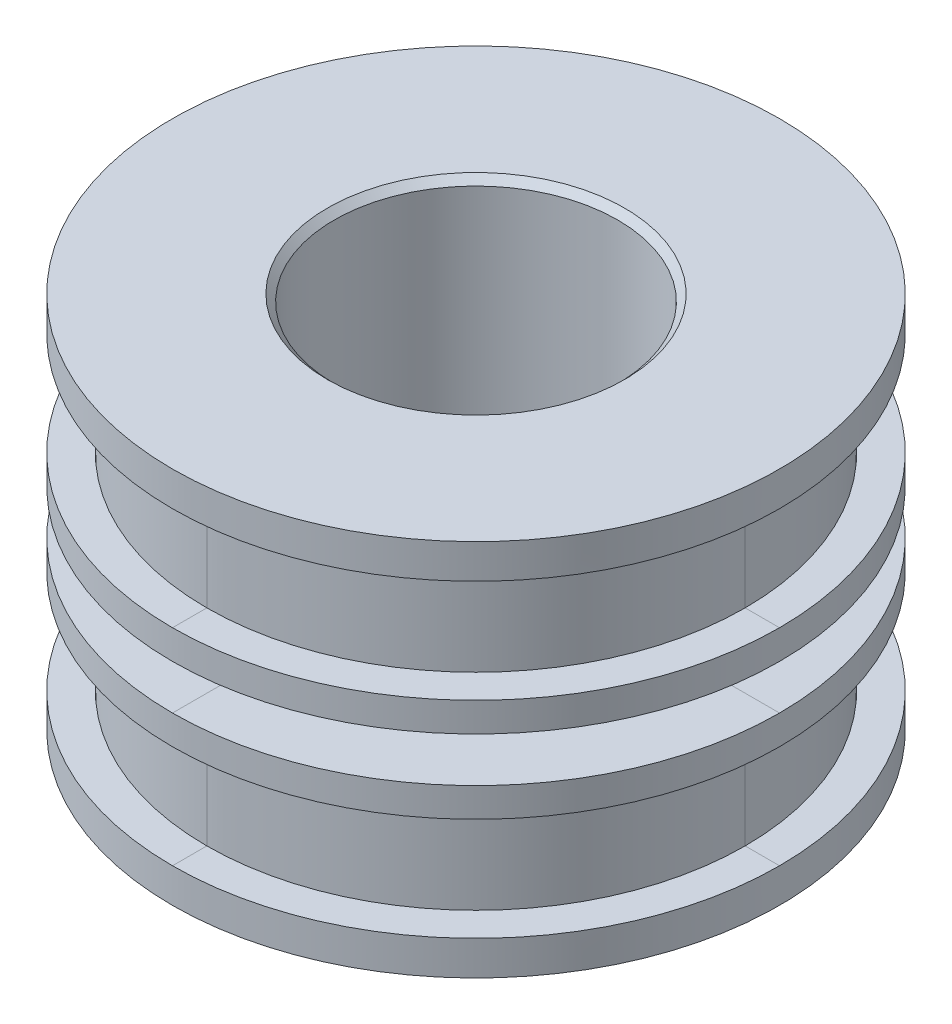
ISO-10303-21;
HEADER;
FILE_DESCRIPTION(('STEP AP214'),'2;1');
FILE_NAME('part.step','',(''),(''),'','','');
FILE_SCHEMA(('AUTOMOTIVE_DESIGN { 1 0 10303 214 1 1 1 1 }'));
ENDSEC;
DATA;
#1=APPLICATION_CONTEXT('core data for automotive mechanical design processes');
#2=APPLICATION_PROTOCOL_DEFINITION('international standard','automotive_design',2000,#1);
#3=PRODUCT_CONTEXT('',#1,'mechanical');
#4=PRODUCT('Part','Part','',(#3));
#5=PRODUCT_RELATED_PRODUCT_CATEGORY('part','',(#4));
#6=PRODUCT_DEFINITION_FORMATION('','',#4);
#7=PRODUCT_DEFINITION_CONTEXT('part definition',#1,'design');
#8=PRODUCT_DEFINITION('design','',#6,#7);
#9=PRODUCT_DEFINITION_SHAPE('','',#8);
#10=(LENGTH_UNIT() NAMED_UNIT(*) SI_UNIT(.MILLI.,.METRE.));
#11=(NAMED_UNIT(*) PLANE_ANGLE_UNIT() SI_UNIT($,.RADIAN.));
#12=(NAMED_UNIT(*) SI_UNIT($,.STERADIAN.) SOLID_ANGLE_UNIT());
#13=UNCERTAINTY_MEASURE_WITH_UNIT(LENGTH_MEASURE(1.E-05),#10,'distance_accuracy_value','');
#14=(GEOMETRIC_REPRESENTATION_CONTEXT(3) GLOBAL_UNCERTAINTY_ASSIGNED_CONTEXT((#13)) GLOBAL_UNIT_ASSIGNED_CONTEXT((#10,
#11,#12)) REPRESENTATION_CONTEXT('',''));
#15=CARTESIAN_POINT('',(0.,0.,0.));
#16=DIRECTION('',(0.,0.,1.));
#17=DIRECTION('',(1.,0.,0.));
#18=AXIS2_PLACEMENT_3D('',#15,#16,#17);
#19=CARTESIAN_POINT('',(0.,-27.5,0.));
#20=DIRECTION('',(0.,1.,0.));
#21=DIRECTION('',(0.,0.,1.));
#22=AXIS2_PLACEMENT_3D('',#19,#20,#21);
#23=CYLINDRICAL_SURFACE('',#22,20.625);
#24=CARTESIAN_POINT('',(0.,26.5,0.));
#25=DIRECTION('',(0.,1.,0.));
#26=DIRECTION('',(0.,0.,1.));
#27=AXIS2_PLACEMENT_3D('',#24,#25,#26);
#28=CIRCLE('',#27,20.625);
#29=CARTESIAN_POINT('',(0.,26.5,20.625));
#30=VERTEX_POINT('',#29);
#31=EDGE_CURVE('E314',#30,#30,#28,.T.);
#32=ORIENTED_EDGE('',*,*,#31,.T.);
#33=EDGE_LOOP('',(#32));
#34=FACE_BOUND('',#33,.T.);
#35=CARTESIAN_POINT('',(0.,-12.5,0.));
#36=DIRECTION('',(0.,-1.,0.));
#37=DIRECTION('',(0.,0.,-1.));
#38=AXIS2_PLACEMENT_3D('',#35,#36,#37);
#39=CIRCLE('',#38,20.625);
#40=CARTESIAN_POINT('',(0.,-12.5,-20.625));
#41=VERTEX_POINT('',#40);
#42=EDGE_CURVE('E169',#41,#41,#39,.F.);
#43=ORIENTED_EDGE('',*,*,#42,.F.);
#44=EDGE_LOOP('',(#43));
#45=FACE_BOUND('',#44,.T.);
#46=ADVANCED_FACE('F45',(#34,#45),#23,.F.);
#47=CARTESIAN_POINT('',(0.,27.5,0.));
#48=DIRECTION('',(0.,-1.,0.));
#49=DIRECTION('',(0.,0.,-1.));
#50=AXIS2_PLACEMENT_3D('',#47,#48,#49);
#51=CYLINDRICAL_SURFACE('',#50,44.175);
#52=CARTESIAN_POINT('',(0.,-3.25,0.));
#53=DIRECTION('',(0.,-1.,0.));
#54=DIRECTION('',(1.,0.,0.));
#55=AXIS2_PLACEMENT_3D('',#52,#53,#54);
#56=CIRCLE('',#55,44.175);
#57=CARTESIAN_POINT('',(44.175,-3.25,0.));
#58=VERTEX_POINT('',#57);
#59=CARTESIAN_POINT('',(0.,-3.25,44.175));
#60=VERTEX_POINT('',#59);
#61=EDGE_CURVE('E262',#58,#60,#56,.T.);
#62=ORIENTED_EDGE('',*,*,#61,.T.);
#63=CARTESIAN_POINT('',(0.,-3.25,0.));
#64=DIRECTION('',(0.,-1.,0.));
#65=DIRECTION('',(0.,0.,1.));
#66=AXIS2_PLACEMENT_3D('',#63,#64,#65);
#67=CIRCLE('',#66,44.175);
#68=EDGE_CURVE('E272',#60,#58,#67,.T.);
#69=ORIENTED_EDGE('',*,*,#68,.T.);
#70=EDGE_LOOP('',(#62,#69));
#71=FACE_BOUND('',#70,.T.);
#72=CARTESIAN_POINT('',(0.,-7.5,0.));
#73=DIRECTION('',(0.,-1.,0.));
#74=DIRECTION('',(1.,0.,0.));
#75=AXIS2_PLACEMENT_3D('',#72,#73,#74);
#76=CIRCLE('',#75,44.175);
#77=CARTESIAN_POINT('',(44.175,-7.5,0.));
#78=VERTEX_POINT('',#77);
#79=CARTESIAN_POINT('',(0.,-7.5,44.175));
#80=VERTEX_POINT('',#79);
#81=EDGE_CURVE('E193',#78,#80,#76,.T.);
#82=ORIENTED_EDGE('',*,*,#81,.F.);
#83=CARTESIAN_POINT('',(0.,-7.5,0.));
#84=DIRECTION('',(0.,-1.,0.));
#85=DIRECTION('',(0.,0.,1.));
#86=AXIS2_PLACEMENT_3D('',#83,#84,#85);
#87=CIRCLE('',#86,44.175);
#88=EDGE_CURVE('E159',#80,#78,#87,.T.);
#89=ORIENTED_EDGE('',*,*,#88,.F.);
#90=EDGE_LOOP('',(#82,#89));
#91=FACE_BOUND('',#90,.T.);
#92=ADVANCED_FACE('F340',(#71,#91),#51,.T.);
#93=CARTESIAN_POINT('',(0.,3.25,0.));
#94=DIRECTION('',(0.,-1.,0.));
#95=DIRECTION('',(1.,0.,0.));
#96=AXIS2_PLACEMENT_3D('',#93,#94,#95);
#97=CIRCLE('',#96,44.175);
#98=CARTESIAN_POINT('',(44.175,3.25,0.));
#99=VERTEX_POINT('',#98);
#100=CARTESIAN_POINT('',(0.,3.25,44.175));
#101=VERTEX_POINT('',#100);
#102=EDGE_CURVE('E257',#99,#101,#97,.T.);
#103=ORIENTED_EDGE('',*,*,#102,.F.);
#104=CARTESIAN_POINT('',(0.,3.25,0.));
#105=DIRECTION('',(0.,-1.,0.));
#106=DIRECTION('',(0.,0.,1.));
#107=AXIS2_PLACEMENT_3D('',#104,#105,#106);
#108=CIRCLE('',#107,44.175);
#109=EDGE_CURVE('E267',#101,#99,#108,.T.);
#110=ORIENTED_EDGE('',*,*,#109,.F.);
#111=EDGE_LOOP('',(#103,#110));
#112=FACE_BOUND('',#111,.T.);
#113=CARTESIAN_POINT('',(0.,7.5,0.));
#114=DIRECTION('',(0.,-1.,0.));
#115=DIRECTION('',(1.,0.,0.));
#116=AXIS2_PLACEMENT_3D('',#113,#114,#115);
#117=CIRCLE('',#116,44.175);
#118=CARTESIAN_POINT('',(44.175,7.5,0.));
#119=VERTEX_POINT('',#118);
#120=CARTESIAN_POINT('',(0.,7.5,44.175));
#121=VERTEX_POINT('',#120);
#122=EDGE_CURVE('E209',#119,#121,#117,.T.);
#123=ORIENTED_EDGE('',*,*,#122,.T.);
#124=CARTESIAN_POINT('',(0.,7.5,0.));
#125=DIRECTION('',(0.,-1.,0.));
#126=DIRECTION('',(0.,0.,1.));
#127=AXIS2_PLACEMENT_3D('',#124,#125,#126);
#128=CIRCLE('',#127,44.175);
#129=EDGE_CURVE('E219',#121,#119,#128,.T.);
#130=ORIENTED_EDGE('',*,*,#129,.T.);
#131=EDGE_LOOP('',(#123,#130));
#132=FACE_BOUND('',#131,.T.);
#133=ADVANCED_FACE('F346',(#112,#132),#51,.T.);
#134=CARTESIAN_POINT('',(0.,-3.25,33.175));
#135=DIRECTION('',(0.,-1.,0.));
#136=DIRECTION('',(0.,0.,-1.));
#137=AXIS2_PLACEMENT_3D('',#134,#135,#136);
#138=PLANE('',#137);
#139=DIRECTION('',(1.,0.,0.));
#140=VECTOR('',#139,1.);
#141=CARTESIAN_POINT('',(33.175,-3.25,0.));
#142=LINE('',#141,#140);
#143=CARTESIAN_POINT('',(33.175,-3.25,0.));
#144=VERTEX_POINT('',#143);
#145=EDGE_CURVE('E266',#144,#58,#142,.T.);
#146=ORIENTED_EDGE('',*,*,#145,.T.);
#147=ORIENTED_EDGE('',*,*,#68,.F.);
#148=DIRECTION('',(0.,0.,1.));
#149=VECTOR('',#148,1.);
#150=CARTESIAN_POINT('',(0.,-3.25,33.175));
#151=LINE('',#150,#149);
#152=CARTESIAN_POINT('',(0.,-3.25,33.175));
#153=VERTEX_POINT('',#152);
#154=EDGE_CURVE('E276',#153,#60,#151,.T.);
#155=ORIENTED_EDGE('',*,*,#154,.F.);
#156=CARTESIAN_POINT('',(0.,-3.25,0.));
#157=DIRECTION('',(0.,-1.,0.));
#158=DIRECTION('',(0.,0.,1.));
#159=AXIS2_PLACEMENT_3D('',#156,#157,#158);
#160=CIRCLE('',#159,33.175);
#161=EDGE_CURVE('E291',#153,#144,#160,.T.);
#162=ORIENTED_EDGE('',*,*,#161,.T.);
#163=EDGE_LOOP('',(#146,#147,#155,#162));
#164=FACE_BOUND('',#163,.T.);
#165=ADVANCED_FACE('F410',(#164),#138,.F.);
#166=CARTESIAN_POINT('',(0.,27.5,0.));
#167=DIRECTION('',(0.,-1.,0.));
#168=DIRECTION('',(0.,0.,-1.));
#169=AXIS2_PLACEMENT_3D('',#166,#167,#168);
#170=CYLINDRICAL_SURFACE('',#169,33.175);
#171=DIRECTION('',(0.,-1.,0.));
#172=VECTOR('',#171,1.);
#173=CARTESIAN_POINT('',(33.175,-3.25,0.));
#174=LINE('',#173,#172);
#175=CARTESIAN_POINT('',(33.175,3.25,0.));
#176=VERTEX_POINT('',#175);
#177=EDGE_CURVE('E280',#176,#144,#174,.T.);
#178=ORIENTED_EDGE('',*,*,#177,.T.);
#179=ORIENTED_EDGE('',*,*,#161,.F.);
#180=DIRECTION('',(0.,-1.,0.));
#181=VECTOR('',#180,1.);
#182=CARTESIAN_POINT('',(0.,-3.25,33.175));
#183=LINE('',#182,#181);
#184=CARTESIAN_POINT('',(0.,3.25,33.175));
#185=VERTEX_POINT('',#184);
#186=EDGE_CURVE('E288',#185,#153,#183,.T.);
#187=ORIENTED_EDGE('',*,*,#186,.F.);
#188=CARTESIAN_POINT('',(0.,3.25,0.));
#189=DIRECTION('',(0.,-1.,0.));
#190=DIRECTION('',(0.,0.,1.));
#191=AXIS2_PLACEMENT_3D('',#188,#189,#190);
#192=CIRCLE('',#191,33.175);
#193=EDGE_CURVE('E271',#185,#176,#192,.T.);
#194=ORIENTED_EDGE('',*,*,#193,.T.);
#195=EDGE_LOOP('',(#178,#179,#187,#194));
#196=FACE_BOUND('',#195,.T.);
#197=ADVANCED_FACE('F403',(#196),#170,.T.);
#198=CARTESIAN_POINT('',(0.,3.25,33.175));
#199=DIRECTION('',(0.,1.,0.));
#200=DIRECTION('',(0.,0.,1.));
#201=AXIS2_PLACEMENT_3D('',#198,#199,#200);
#202=PLANE('',#201);
#203=DIRECTION('',(-1.,0.,0.));
#204=VECTOR('',#203,1.);
#205=CARTESIAN_POINT('',(33.175,3.25,0.));
#206=LINE('',#205,#204);
#207=EDGE_CURVE('E251',#99,#176,#206,.T.);
#208=ORIENTED_EDGE('',*,*,#207,.T.);
#209=ORIENTED_EDGE('',*,*,#193,.F.);
#210=DIRECTION('',(0.,0.,-1.));
#211=VECTOR('',#210,1.);
#212=CARTESIAN_POINT('',(0.,3.25,33.175));
#213=LINE('',#212,#211);
#214=EDGE_CURVE('E261',#101,#185,#213,.T.);
#215=ORIENTED_EDGE('',*,*,#214,.F.);
#216=ORIENTED_EDGE('',*,*,#109,.T.);
#217=EDGE_LOOP('',(#208,#209,#215,#216));
#218=FACE_BOUND('',#217,.T.);
#219=ADVANCED_FACE('F399',(#218),#202,.F.);
#220=CARTESIAN_POINT('',(33.175,-3.25,0.));
#221=DIRECTION('',(0.,-1.,0.));
#222=DIRECTION('',(0.,0.,-1.));
#223=AXIS2_PLACEMENT_3D('',#220,#221,#222);
#224=PLANE('',#223);
#225=ORIENTED_EDGE('',*,*,#154,.T.);
#226=ORIENTED_EDGE('',*,*,#61,.F.);
#227=ORIENTED_EDGE('',*,*,#145,.F.);
#228=CARTESIAN_POINT('',(0.,-3.25,0.));
#229=DIRECTION('',(0.,-1.,0.));
#230=DIRECTION('',(1.,0.,0.));
#231=AXIS2_PLACEMENT_3D('',#228,#229,#230);
#232=CIRCLE('',#231,33.175);
#233=EDGE_CURVE('E298',#144,#153,#232,.T.);
#234=ORIENTED_EDGE('',*,*,#233,.T.);
#235=EDGE_LOOP('',(#225,#226,#227,#234));
#236=FACE_BOUND('',#235,.T.);
#237=ADVANCED_FACE('F402',(#236),#224,.F.);
#238=CARTESIAN_POINT('',(0.,27.5,0.));
#239=DIRECTION('',(0.,-1.,0.));
#240=DIRECTION('',(0.,0.,-1.));
#241=AXIS2_PLACEMENT_3D('',#238,#239,#240);
#242=CYLINDRICAL_SURFACE('',#241,33.175);
#243=ORIENTED_EDGE('',*,*,#233,.F.);
#244=ORIENTED_EDGE('',*,*,#177,.F.);
#245=CARTESIAN_POINT('',(0.,3.25,0.));
#246=DIRECTION('',(0.,-1.,0.));
#247=DIRECTION('',(1.,0.,0.));
#248=AXIS2_PLACEMENT_3D('',#245,#246,#247);
#249=CIRCLE('',#248,33.175);
#250=EDGE_CURVE('E284',#176,#185,#249,.T.);
#251=ORIENTED_EDGE('',*,*,#250,.T.);
#252=ORIENTED_EDGE('',*,*,#186,.T.);
#253=EDGE_LOOP('',(#243,#244,#251,#252));
#254=FACE_BOUND('',#253,.T.);
#255=ADVANCED_FACE('F397',(#254),#242,.T.);
#256=CARTESIAN_POINT('',(33.175,3.25,0.));
#257=DIRECTION('',(0.,1.,0.));
#258=DIRECTION('',(0.,0.,1.));
#259=AXIS2_PLACEMENT_3D('',#256,#257,#258);
#260=PLANE('',#259);
#261=ORIENTED_EDGE('',*,*,#250,.F.);
#262=ORIENTED_EDGE('',*,*,#207,.F.);
#263=ORIENTED_EDGE('',*,*,#102,.T.);
#264=ORIENTED_EDGE('',*,*,#214,.T.);
#265=EDGE_LOOP('',(#261,#262,#263,#264));
#266=FACE_BOUND('',#265,.T.);
#267=ADVANCED_FACE('F393',(#266),#260,.F.);
#268=CARTESIAN_POINT('',(0.,7.5,39.175));
#269=DIRECTION('',(0.,-1.,0.));
#270=DIRECTION('',(0.,0.,-1.));
#271=AXIS2_PLACEMENT_3D('',#268,#269,#270);
#272=PLANE('',#271);
#273=DIRECTION('',(1.,0.,0.));
#274=VECTOR('',#273,1.);
#275=CARTESIAN_POINT('',(39.175,7.5,0.));
#276=LINE('',#275,#274);
#277=CARTESIAN_POINT('',(39.175,7.5,0.));
#278=VERTEX_POINT('',#277);
#279=EDGE_CURVE('E213',#278,#119,#276,.T.);
#280=ORIENTED_EDGE('',*,*,#279,.T.);
#281=ORIENTED_EDGE('',*,*,#129,.F.);
#282=DIRECTION('',(0.,0.,1.));
#283=VECTOR('',#282,1.);
#284=CARTESIAN_POINT('',(0.,7.5,39.175));
#285=LINE('',#284,#283);
#286=CARTESIAN_POINT('',(0.,7.5,39.175));
#287=VERTEX_POINT('',#286);
#288=EDGE_CURVE('E223',#287,#121,#285,.T.);
#289=ORIENTED_EDGE('',*,*,#288,.F.);
#290=CARTESIAN_POINT('',(0.,7.5,0.));
#291=DIRECTION('',(0.,-1.,0.));
#292=DIRECTION('',(0.,0.,1.));
#293=AXIS2_PLACEMENT_3D('',#290,#291,#292);
#294=CIRCLE('',#293,39.175);
#295=EDGE_CURVE('E238',#287,#278,#294,.T.);
#296=ORIENTED_EDGE('',*,*,#295,.T.);
#297=EDGE_LOOP('',(#280,#281,#289,#296));
#298=FACE_BOUND('',#297,.T.);
#299=ADVANCED_FACE('F386',(#298),#272,.F.);
#300=CARTESIAN_POINT('',(0.,27.5,0.));
#301=DIRECTION('',(0.,-1.,0.));
#302=DIRECTION('',(0.,0.,-1.));
#303=AXIS2_PLACEMENT_3D('',#300,#301,#302);
#304=CYLINDRICAL_SURFACE('',#303,39.175);
#305=DIRECTION('',(0.,-1.,0.));
#306=VECTOR('',#305,1.);
#307=CARTESIAN_POINT('',(39.175,7.5,0.));
#308=LINE('',#307,#306);
#309=CARTESIAN_POINT('',(39.175,22.5,0.));
#310=VERTEX_POINT('',#309);
#311=EDGE_CURVE('E227',#310,#278,#308,.T.);
#312=ORIENTED_EDGE('',*,*,#311,.T.);
#313=ORIENTED_EDGE('',*,*,#295,.F.);
#314=DIRECTION('',(0.,-1.,0.));
#315=VECTOR('',#314,1.);
#316=CARTESIAN_POINT('',(0.,7.5,39.175));
#317=LINE('',#316,#315);
#318=CARTESIAN_POINT('',(0.,22.5,39.175));
#319=VERTEX_POINT('',#318);
#320=EDGE_CURVE('E235',#319,#287,#317,.T.);
#321=ORIENTED_EDGE('',*,*,#320,.F.);
#322=CARTESIAN_POINT('',(0.,22.5,0.));
#323=DIRECTION('',(0.,-1.,0.));
#324=DIRECTION('',(0.,0.,1.));
#325=AXIS2_PLACEMENT_3D('',#322,#323,#324);
#326=CIRCLE('',#325,39.175);
#327=EDGE_CURVE('E218',#319,#310,#326,.T.);
#328=ORIENTED_EDGE('',*,*,#327,.T.);
#329=EDGE_LOOP('',(#312,#313,#321,#328));
#330=FACE_BOUND('',#329,.T.);
#331=ADVANCED_FACE('F379',(#330),#304,.T.);
#332=CARTESIAN_POINT('',(0.,22.5,39.175));
#333=DIRECTION('',(0.,1.,0.));
#334=DIRECTION('',(0.,0.,1.));
#335=AXIS2_PLACEMENT_3D('',#332,#333,#334);
#336=PLANE('',#335);
#337=DIRECTION('',(-1.,0.,0.));
#338=VECTOR('',#337,1.);
#339=CARTESIAN_POINT('',(39.175,22.5,0.));
#340=LINE('',#339,#338);
#341=CARTESIAN_POINT('',(44.175,22.5,0.));
#342=VERTEX_POINT('',#341);
#343=EDGE_CURVE('E200',#342,#310,#340,.T.);
#344=ORIENTED_EDGE('',*,*,#343,.T.);
#345=ORIENTED_EDGE('',*,*,#327,.F.);
#346=DIRECTION('',(0.,0.,-1.));
#347=VECTOR('',#346,1.);
#348=CARTESIAN_POINT('',(0.,22.5,39.175));
#349=LINE('',#348,#347);
#350=CARTESIAN_POINT('',(0.,22.5,44.175));
#351=VERTEX_POINT('',#350);
#352=EDGE_CURVE('E208',#351,#319,#349,.T.);
#353=ORIENTED_EDGE('',*,*,#352,.F.);
#354=CARTESIAN_POINT('',(0.,22.5,0.));
#355=DIRECTION('',(0.,-1.,0.));
#356=DIRECTION('',(0.,0.,1.));
#357=AXIS2_PLACEMENT_3D('',#354,#355,#356);
#358=CIRCLE('',#357,44.175);
#359=EDGE_CURVE('E214',#351,#342,#358,.T.);
#360=ORIENTED_EDGE('',*,*,#359,.T.);
#361=EDGE_LOOP('',(#344,#345,#353,#360));
#362=FACE_BOUND('',#361,.T.);
#363=ADVANCED_FACE('F375',(#362),#336,.F.);
#364=CARTESIAN_POINT('',(39.175,7.5,0.));
#365=DIRECTION('',(0.,-1.,0.));
#366=DIRECTION('',(0.,0.,-1.));
#367=AXIS2_PLACEMENT_3D('',#364,#365,#366);
#368=PLANE('',#367);
#369=ORIENTED_EDGE('',*,*,#288,.T.);
#370=ORIENTED_EDGE('',*,*,#122,.F.);
#371=ORIENTED_EDGE('',*,*,#279,.F.);
#372=CARTESIAN_POINT('',(0.,7.5,0.));
#373=DIRECTION('',(0.,-1.,0.));
#374=DIRECTION('',(1.,0.,0.));
#375=AXIS2_PLACEMENT_3D('',#372,#373,#374);
#376=CIRCLE('',#375,39.175);
#377=EDGE_CURVE('E245',#278,#287,#376,.T.);
#378=ORIENTED_EDGE('',*,*,#377,.T.);
#379=EDGE_LOOP('',(#369,#370,#371,#378));
#380=FACE_BOUND('',#379,.T.);
#381=ADVANCED_FACE('F378',(#380),#368,.F.);
#382=CARTESIAN_POINT('',(0.,27.5,0.));
#383=DIRECTION('',(0.,-1.,0.));
#384=DIRECTION('',(0.,0.,-1.));
#385=AXIS2_PLACEMENT_3D('',#382,#383,#384);
#386=CYLINDRICAL_SURFACE('',#385,39.175);
#387=ORIENTED_EDGE('',*,*,#377,.F.);
#388=ORIENTED_EDGE('',*,*,#311,.F.);
#389=CARTESIAN_POINT('',(0.,22.5,0.));
#390=DIRECTION('',(0.,-1.,0.));
#391=DIRECTION('',(1.,0.,0.));
#392=AXIS2_PLACEMENT_3D('',#389,#390,#391);
#393=CIRCLE('',#392,39.175);
#394=EDGE_CURVE('E231',#310,#319,#393,.T.);
#395=ORIENTED_EDGE('',*,*,#394,.T.);
#396=ORIENTED_EDGE('',*,*,#320,.T.);
#397=EDGE_LOOP('',(#387,#388,#395,#396));
#398=FACE_BOUND('',#397,.T.);
#399=ADVANCED_FACE('F373',(#398),#386,.T.);
#400=CARTESIAN_POINT('',(39.175,22.5,0.));
#401=DIRECTION('',(0.,1.,0.));
#402=DIRECTION('',(0.,0.,1.));
#403=AXIS2_PLACEMENT_3D('',#400,#401,#402);
#404=PLANE('',#403);
#405=ORIENTED_EDGE('',*,*,#394,.F.);
#406=ORIENTED_EDGE('',*,*,#343,.F.);
#407=CARTESIAN_POINT('',(0.,22.5,0.));
#408=DIRECTION('',(0.,-1.,0.));
#409=DIRECTION('',(1.,0.,0.));
#410=AXIS2_PLACEMENT_3D('',#407,#408,#409);
#411=CIRCLE('',#410,44.175);
#412=EDGE_CURVE('E204',#342,#351,#411,.T.);
#413=ORIENTED_EDGE('',*,*,#412,.T.);
#414=ORIENTED_EDGE('',*,*,#352,.T.);
#415=EDGE_LOOP('',(#405,#406,#413,#414));
#416=FACE_BOUND('',#415,.T.);
#417=ADVANCED_FACE('F369',(#416),#404,.F.);
#418=CARTESIAN_POINT('',(0.,27.5,0.));
#419=DIRECTION('',(0.,1.,0.));
#420=DIRECTION('',(0.,0.,1.));
#421=AXIS2_PLACEMENT_3D('',#418,#419,#420);
#422=PLANE('',#421);
#423=CARTESIAN_POINT('',(0.,27.5,0.));
#424=DIRECTION('',(0.,1.,0.));
#425=DIRECTION('',(0.,0.,1.));
#426=AXIS2_PLACEMENT_3D('',#423,#424,#425);
#427=CIRCLE('',#426,21.625);
#428=CARTESIAN_POINT('',(0.,27.5,21.625));
#429=VERTEX_POINT('',#428);
#430=EDGE_CURVE('E321',#429,#429,#427,.F.);
#431=ORIENTED_EDGE('',*,*,#430,.T.);
#432=EDGE_LOOP('',(#431));
#433=FACE_BOUND('',#432,.T.);
#434=CARTESIAN_POINT('',(0.,27.5,0.));
#435=DIRECTION('',(0.,1.,0.));
#436=DIRECTION('',(0.,0.,1.));
#437=AXIS2_PLACEMENT_3D('',#434,#435,#436);
#438=CIRCLE('',#437,44.175);
#439=CARTESIAN_POINT('',(0.,27.5,44.175));
#440=VERTEX_POINT('',#439);
#441=EDGE_CURVE('E310',#440,#440,#438,.T.);
#442=ORIENTED_EDGE('',*,*,#441,.T.);
#443=EDGE_LOOP('',(#442));
#444=FACE_BOUND('',#443,.T.);
#445=ADVANCED_FACE('F372',(#433,#444),#422,.T.);
#446=ORIENTED_EDGE('',*,*,#412,.F.);
#447=ORIENTED_EDGE('',*,*,#359,.F.);
#448=EDGE_LOOP('',(#446,#447));
#449=FACE_BOUND('',#448,.T.);
#450=ORIENTED_EDGE('',*,*,#441,.F.);
#451=EDGE_LOOP('',(#450));
#452=FACE_BOUND('',#451,.T.);
#453=ADVANCED_FACE('F349',(#449,#452),#51,.T.);
#454=CARTESIAN_POINT('',(0.,-7.5,39.175));
#455=DIRECTION('',(0.,1.,0.));
#456=DIRECTION('',(0.,0.,1.));
#457=AXIS2_PLACEMENT_3D('',#454,#455,#456);
#458=PLANE('',#457);
#459=DIRECTION('',(1.,0.,0.));
#460=VECTOR('',#459,1.);
#461=CARTESIAN_POINT('',(39.175,-7.5,0.));
#462=LINE('',#461,#460);
#463=CARTESIAN_POINT('',(39.175,-7.5,0.));
#464=VERTEX_POINT('',#463);
#465=EDGE_CURVE('E62',#78,#464,#462,.F.);
#466=ORIENTED_EDGE('',*,*,#465,.T.);
#467=CARTESIAN_POINT('',(0.,-7.5,0.));
#468=DIRECTION('',(0.,-1.,0.));
#469=DIRECTION('',(0.,0.,1.));
#470=AXIS2_PLACEMENT_3D('',#467,#468,#469);
#471=CIRCLE('',#470,39.175);
#472=CARTESIAN_POINT('',(0.,-7.5,39.175));
#473=VERTEX_POINT('',#472);
#474=EDGE_CURVE('E139',#473,#464,#471,.T.);
#475=ORIENTED_EDGE('',*,*,#474,.F.);
#476=DIRECTION('',(0.,0.,1.));
#477=VECTOR('',#476,1.);
#478=CARTESIAN_POINT('',(0.,-7.5,39.175));
#479=LINE('',#478,#477);
#480=EDGE_CURVE('E150',#80,#473,#479,.F.);
#481=ORIENTED_EDGE('',*,*,#480,.F.);
#482=ORIENTED_EDGE('',*,*,#88,.T.);
#483=EDGE_LOOP('',(#466,#475,#481,#482));
#484=FACE_BOUND('',#483,.T.);
#485=ADVANCED_FACE('F157',(#484),#458,.F.);
#486=CARTESIAN_POINT('',(0.,-22.5,39.175));
#487=DIRECTION('',(0.,-1.,0.));
#488=DIRECTION('',(0.,0.,-1.));
#489=AXIS2_PLACEMENT_3D('',#486,#487,#488);
#490=PLANE('',#489);
#491=DIRECTION('',(-1.,0.,0.));
#492=VECTOR('',#491,1.);
#493=CARTESIAN_POINT('',(39.175,-22.5,0.));
#494=LINE('',#493,#492);
#495=CARTESIAN_POINT('',(39.175,-22.5,0.));
#496=VERTEX_POINT('',#495);
#497=CARTESIAN_POINT('',(44.175,-22.5,0.));
#498=VERTEX_POINT('',#497);
#499=EDGE_CURVE('E162',#496,#498,#494,.F.);
#500=ORIENTED_EDGE('',*,*,#499,.T.);
#501=CARTESIAN_POINT('',(0.,-22.5,0.));
#502=DIRECTION('',(0.,-1.,0.));
#503=DIRECTION('',(0.,0.,1.));
#504=AXIS2_PLACEMENT_3D('',#501,#502,#503);
#505=CIRCLE('',#504,44.175);
#506=CARTESIAN_POINT('',(0.,-22.5,44.175));
#507=VERTEX_POINT('',#506);
#508=EDGE_CURVE('E185',#507,#498,#505,.T.);
#509=ORIENTED_EDGE('',*,*,#508,.F.);
#510=DIRECTION('',(0.,0.,-1.));
#511=VECTOR('',#510,1.);
#512=CARTESIAN_POINT('',(0.,-22.5,39.175));
#513=LINE('',#512,#511);
#514=CARTESIAN_POINT('',(0.,-22.5,39.175));
#515=VERTEX_POINT('',#514);
#516=EDGE_CURVE('E70',#515,#507,#513,.F.);
#517=ORIENTED_EDGE('',*,*,#516,.F.);
#518=CARTESIAN_POINT('',(0.,-22.5,0.));
#519=DIRECTION('',(0.,-1.,0.));
#520=DIRECTION('',(0.,0.,1.));
#521=AXIS2_PLACEMENT_3D('',#518,#519,#520);
#522=CIRCLE('',#521,39.175);
#523=EDGE_CURVE('E149',#515,#496,#522,.T.);
#524=ORIENTED_EDGE('',*,*,#523,.T.);
#525=EDGE_LOOP('',(#500,#509,#517,#524));
#526=FACE_BOUND('',#525,.T.);
#527=ADVANCED_FACE('F361',(#526),#490,.F.);
#528=CARTESIAN_POINT('',(39.175,-7.5,0.));
#529=DIRECTION('',(0.,1.,0.));
#530=DIRECTION('',(0.,0.,1.));
#531=AXIS2_PLACEMENT_3D('',#528,#529,#530);
#532=PLANE('',#531);
#533=ORIENTED_EDGE('',*,*,#480,.T.);
#534=CARTESIAN_POINT('',(0.,-7.5,0.));
#535=DIRECTION('',(0.,-1.,0.));
#536=DIRECTION('',(1.,0.,0.));
#537=AXIS2_PLACEMENT_3D('',#534,#535,#536);
#538=CIRCLE('',#537,39.175);
#539=EDGE_CURVE('E152',#464,#473,#538,.T.);
#540=ORIENTED_EDGE('',*,*,#539,.F.);
#541=ORIENTED_EDGE('',*,*,#465,.F.);
#542=ORIENTED_EDGE('',*,*,#81,.T.);
#543=EDGE_LOOP('',(#533,#540,#541,#542));
#544=FACE_BOUND('',#543,.T.);
#545=ADVANCED_FACE('F153',(#544),#532,.F.);
#546=CARTESIAN_POINT('',(39.175,-22.5,0.));
#547=DIRECTION('',(0.,-1.,0.));
#548=DIRECTION('',(0.,0.,-1.));
#549=AXIS2_PLACEMENT_3D('',#546,#547,#548);
#550=PLANE('',#549);
#551=CARTESIAN_POINT('',(0.,-22.5,0.));
#552=DIRECTION('',(0.,-1.,0.));
#553=DIRECTION('',(1.,0.,0.));
#554=AXIS2_PLACEMENT_3D('',#551,#552,#553);
#555=CIRCLE('',#554,44.175);
#556=EDGE_CURVE('E189',#498,#507,#555,.T.);
#557=ORIENTED_EDGE('',*,*,#556,.F.);
#558=ORIENTED_EDGE('',*,*,#499,.F.);
#559=CARTESIAN_POINT('',(0.,-22.5,0.));
#560=DIRECTION('',(0.,-1.,0.));
#561=DIRECTION('',(1.,0.,0.));
#562=AXIS2_PLACEMENT_3D('',#559,#560,#561);
#563=CIRCLE('',#562,39.175);
#564=EDGE_CURVE('E166',#496,#515,#563,.T.);
#565=ORIENTED_EDGE('',*,*,#564,.T.);
#566=ORIENTED_EDGE('',*,*,#516,.T.);
#567=EDGE_LOOP('',(#557,#558,#565,#566));
#568=FACE_BOUND('',#567,.T.);
#569=ADVANCED_FACE('F355',(#568),#550,.F.);
#570=CARTESIAN_POINT('',(0.,-27.5,0.));
#571=DIRECTION('',(0.,-1.,0.));
#572=DIRECTION('',(0.,0.,-1.));
#573=AXIS2_PLACEMENT_3D('',#570,#571,#572);
#574=CYLINDRICAL_SURFACE('',#573,39.175);
#575=ORIENTED_EDGE('',*,*,#564,.F.);
#576=DIRECTION('',(0.,1.,0.));
#577=VECTOR('',#576,1.);
#578=CARTESIAN_POINT('',(39.175,-7.5,0.));
#579=LINE('',#578,#577);
#580=EDGE_CURVE('E142',#464,#496,#579,.F.);
#581=ORIENTED_EDGE('',*,*,#580,.F.);
#582=ORIENTED_EDGE('',*,*,#539,.T.);
#583=DIRECTION('',(0.,1.,0.));
#584=VECTOR('',#583,1.);
#585=CARTESIAN_POINT('',(0.,-7.5,39.175));
#586=LINE('',#585,#584);
#587=EDGE_CURVE('E144',#473,#515,#586,.F.);
#588=ORIENTED_EDGE('',*,*,#587,.T.);
#589=EDGE_LOOP('',(#575,#581,#582,#588));
#590=FACE_BOUND('',#589,.T.);
#591=ADVANCED_FACE('F165',(#590),#574,.T.);
#592=CARTESIAN_POINT('',(0.,-27.5,0.));
#593=DIRECTION('',(0.,-1.,0.));
#594=DIRECTION('',(0.,0.,-1.));
#595=AXIS2_PLACEMENT_3D('',#592,#593,#594);
#596=CYLINDRICAL_SURFACE('',#595,39.175);
#597=ORIENTED_EDGE('',*,*,#580,.T.);
#598=ORIENTED_EDGE('',*,*,#523,.F.);
#599=ORIENTED_EDGE('',*,*,#587,.F.);
#600=ORIENTED_EDGE('',*,*,#474,.T.);
#601=EDGE_LOOP('',(#597,#598,#599,#600));
#602=FACE_BOUND('',#601,.T.);
#603=ADVANCED_FACE('F140',(#602),#596,.T.);
#604=CARTESIAN_POINT('',(0.,-27.5,0.));
#605=DIRECTION('',(0.,1.,0.));
#606=DIRECTION('',(0.,0.,1.));
#607=AXIS2_PLACEMENT_3D('',#604,#605,#606);
#608=PLANE('',#607);
#609=CARTESIAN_POINT('',(0.,-27.5,0.));
#610=DIRECTION('',(0.,1.,0.));
#611=DIRECTION('',(0.,0.,1.));
#612=AXIS2_PLACEMENT_3D('',#609,#610,#611);
#613=CIRCLE('',#612,25.5);
#614=CARTESIAN_POINT('',(0.,-27.5,25.5));
#615=VERTEX_POINT('',#614);
#616=EDGE_CURVE('E11',#615,#615,#613,.T.);
#617=ORIENTED_EDGE('',*,*,#616,.T.);
#618=EDGE_LOOP('',(#617));
#619=FACE_BOUND('',#618,.T.);
#620=CARTESIAN_POINT('',(0.,-27.5,0.));
#621=DIRECTION('',(0.,1.,0.));
#622=DIRECTION('',(0.,0.,1.));
#623=AXIS2_PLACEMENT_3D('',#620,#621,#622);
#624=CIRCLE('',#623,44.175);
#625=CARTESIAN_POINT('',(0.,-27.5,44.175));
#626=VERTEX_POINT('',#625);
#627=EDGE_CURVE('E304',#626,#626,#624,.T.);
#628=ORIENTED_EDGE('',*,*,#627,.F.);
#629=EDGE_LOOP('',(#628));
#630=FACE_BOUND('',#629,.T.);
#631=ADVANCED_FACE('F358',(#619,#630),#608,.F.);
#632=ORIENTED_EDGE('',*,*,#556,.T.);
#633=ORIENTED_EDGE('',*,*,#508,.T.);
#634=EDGE_LOOP('',(#632,#633));
#635=FACE_BOUND('',#634,.T.);
#636=ORIENTED_EDGE('',*,*,#627,.T.);
#637=EDGE_LOOP('',(#636));
#638=FACE_BOUND('',#637,.T.);
#639=ADVANCED_FACE('F422',(#635,#638),#51,.T.);
#640=CARTESIAN_POINT('',(0.,26.5,0.));
#641=DIRECTION('',(0.,1.,0.));
#642=DIRECTION('',(0.,0.,1.));
#643=AXIS2_PLACEMENT_3D('',#640,#641,#642);
#644=CONICAL_SURFACE('',#643,20.625,0.785398163397453);
#645=ORIENTED_EDGE('',*,*,#430,.F.);
#646=EDGE_LOOP('',(#645));
#647=FACE_BOUND('',#646,.T.);
#648=ORIENTED_EDGE('',*,*,#31,.F.);
#649=EDGE_LOOP('',(#648));
#650=FACE_BOUND('',#649,.T.);
#651=ADVANCED_FACE('F427',(#647,#650),#644,.F.);
#652=CARTESIAN_POINT('',(0.,-12.5,0.));
#653=DIRECTION('',(0.,-1.,0.));
#654=DIRECTION('',(0.,0.,-1.));
#655=AXIS2_PLACEMENT_3D('',#652,#653,#654);
#656=PLANE('',#655);
#657=CARTESIAN_POINT('',(0.,-12.5,0.));
#658=DIRECTION('',(0.,-1.,0.));
#659=DIRECTION('',(0.,0.,-1.));
#660=AXIS2_PLACEMENT_3D('',#657,#658,#659);
#661=CIRCLE('',#660,24.5);
#662=CARTESIAN_POINT('',(0.,-12.5,-24.5));
#663=VERTEX_POINT('',#662);
#664=EDGE_CURVE('E176',#663,#663,#661,.T.);
#665=ORIENTED_EDGE('',*,*,#664,.T.);
#666=EDGE_LOOP('',(#665));
#667=FACE_BOUND('',#666,.T.);
#668=ORIENTED_EDGE('',*,*,#42,.T.);
#669=EDGE_LOOP('',(#668));
#670=FACE_BOUND('',#669,.T.);
#671=ADVANCED_FACE('F336',(#667,#670),#656,.T.);
#672=CARTESIAN_POINT('',(0.,-12.5,0.));
#673=DIRECTION('',(0.,-1.,0.));
#674=DIRECTION('',(0.,0.,-1.));
#675=AXIS2_PLACEMENT_3D('',#672,#673,#674);
#676=CYLINDRICAL_SURFACE('',#675,24.5);
#677=CARTESIAN_POINT('',(0.,-26.5,0.));
#678=DIRECTION('',(0.,1.,0.));
#679=DIRECTION('',(0.,0.,1.));
#680=AXIS2_PLACEMENT_3D('',#677,#678,#679);
#681=CIRCLE('',#680,24.5);
#682=CARTESIAN_POINT('',(0.,-26.5,24.5));
#683=VERTEX_POINT('',#682);
#684=EDGE_CURVE('E55',#683,#683,#681,.F.);
#685=ORIENTED_EDGE('',*,*,#684,.T.);
#686=EDGE_LOOP('',(#685));
#687=FACE_BOUND('',#686,.T.);
#688=ORIENTED_EDGE('',*,*,#664,.F.);
#689=EDGE_LOOP('',(#688));
#690=FACE_BOUND('',#689,.T.);
#691=ADVANCED_FACE('F328',(#687,#690),#676,.F.);
#692=CARTESIAN_POINT('',(0.,-26.5,0.));
#693=DIRECTION('',(0.,-1.,0.));
#694=DIRECTION('',(0.,0.,-1.));
#695=AXIS2_PLACEMENT_3D('',#692,#693,#694);
#696=CONICAL_SURFACE('',#695,24.5,0.785398163397448);
#697=ORIENTED_EDGE('',*,*,#616,.F.);
#698=EDGE_LOOP('',(#697));
#699=FACE_BOUND('',#698,.T.);
#700=ORIENTED_EDGE('',*,*,#684,.F.);
#701=EDGE_LOOP('',(#700));
#702=FACE_BOUND('',#701,.T.);
#703=ADVANCED_FACE('F48',(#699,#702),#696,.F.);
#704=CLOSED_SHELL('',(#46,#92,#133,#165,#197,#219,#237,#255,#267,#299,#331,#363,#381,#399,#417,
#445,#453,#485,#527,#545,#569,#591,#603,#631,#639,#651,#671,#691,#703));
#705=MANIFOLD_SOLID_BREP('B2',#704);
#706=ADVANCED_BREP_SHAPE_REPRESENTATION('',(#18,#705),#14);
#707=SHAPE_DEFINITION_REPRESENTATION(#9,#706);
ENDSEC;
END-ISO-10303-21;
